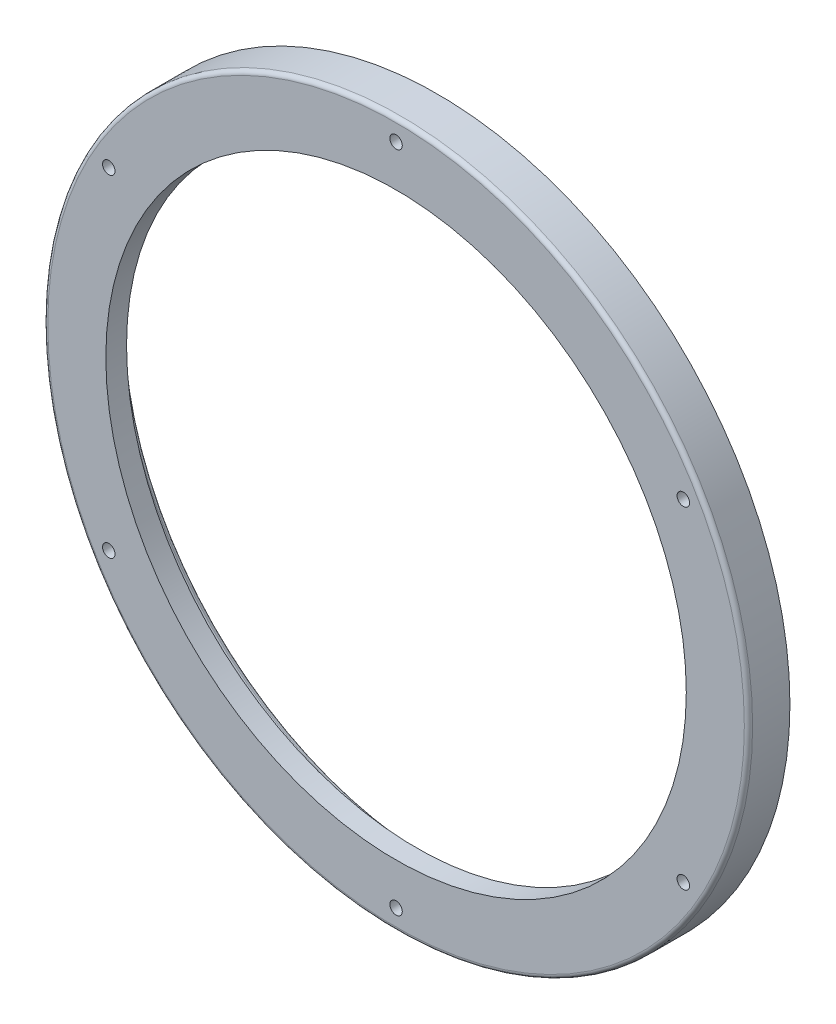
ISO-10303-21;
HEADER;
FILE_DESCRIPTION(('STEP AP214'),'2;1');
FILE_NAME('part.step','',(''),(''),'','','');
FILE_SCHEMA(('AUTOMOTIVE_DESIGN { 1 0 10303 214 1 1 1 1 }'));
ENDSEC;
DATA;
#1=APPLICATION_CONTEXT('core data for automotive mechanical design processes');
#2=APPLICATION_PROTOCOL_DEFINITION('international standard','automotive_design',2000,#1);
#3=PRODUCT_CONTEXT('',#1,'mechanical');
#4=PRODUCT('Part','Part','',(#3));
#5=PRODUCT_RELATED_PRODUCT_CATEGORY('part','',(#4));
#6=PRODUCT_DEFINITION_FORMATION('','',#4);
#7=PRODUCT_DEFINITION_CONTEXT('part definition',#1,'design');
#8=PRODUCT_DEFINITION('design','',#6,#7);
#9=PRODUCT_DEFINITION_SHAPE('','',#8);
#10=(LENGTH_UNIT() NAMED_UNIT(*) SI_UNIT(.MILLI.,.METRE.));
#11=(NAMED_UNIT(*) PLANE_ANGLE_UNIT() SI_UNIT($,.RADIAN.));
#12=(NAMED_UNIT(*) SI_UNIT($,.STERADIAN.) SOLID_ANGLE_UNIT());
#13=UNCERTAINTY_MEASURE_WITH_UNIT(LENGTH_MEASURE(1.E-05),#10,'distance_accuracy_value','');
#14=(GEOMETRIC_REPRESENTATION_CONTEXT(3) GLOBAL_UNCERTAINTY_ASSIGNED_CONTEXT((#13)) GLOBAL_UNIT_ASSIGNED_CONTEXT((#10,
#11,#12)) REPRESENTATION_CONTEXT('',''));
#15=CARTESIAN_POINT('',(0.,0.,0.));
#16=DIRECTION('',(0.,0.,1.));
#17=DIRECTION('',(1.,0.,0.));
#18=AXIS2_PLACEMENT_3D('',#15,#16,#17);
#19=CARTESIAN_POINT('',(0.,0.,10.));
#20=DIRECTION('',(0.,0.,1.));
#21=DIRECTION('',(1.,0.,0.));
#22=AXIS2_PLACEMENT_3D('',#19,#20,#21);
#23=PLANE('',#22);
#24=CARTESIAN_POINT('',(0.,0.,10.));
#25=DIRECTION('',(0.,0.,1.));
#26=DIRECTION('',(1.,0.,0.));
#27=AXIS2_PLACEMENT_3D('',#24,#25,#26);
#28=CIRCLE('',#27,84.);
#29=CARTESIAN_POINT('',(84.,0.,10.));
#30=VERTEX_POINT('',#29);
#31=EDGE_CURVE('E45',#30,#30,#28,.T.);
#32=ORIENTED_EDGE('',*,*,#31,.T.);
#33=EDGE_LOOP('',(#32));
#34=FACE_BOUND('',#33,.T.);
#35=CARTESIAN_POINT('',(69.2820323027546,40.0000000000008,10.));
#36=DIRECTION('',(0.,0.,1.));
#37=DIRECTION('',(1.,0.,0.));
#38=AXIS2_PLACEMENT_3D('',#35,#36,#37);
#39=CIRCLE('',#38,1.5);
#40=CARTESIAN_POINT('',(70.7820323027546,40.0000000000008,10.));
#41=VERTEX_POINT('',#40);
#42=EDGE_CURVE('E75',#41,#41,#39,.F.);
#43=ORIENTED_EDGE('',*,*,#42,.T.);
#44=EDGE_LOOP('',(#43));
#45=FACE_BOUND('',#44,.T.);
#46=CARTESIAN_POINT('',(69.2820323027555,-39.9999999999994,10.));
#47=DIRECTION('',(0.,0.,1.));
#48=DIRECTION('',(1.,0.,0.));
#49=AXIS2_PLACEMENT_3D('',#46,#47,#48);
#50=CIRCLE('',#49,1.5);
#51=CARTESIAN_POINT('',(70.7820323027555,-39.9999999999994,10.));
#52=VERTEX_POINT('',#51);
#53=EDGE_CURVE('E82',#52,#52,#50,.F.);
#54=ORIENTED_EDGE('',*,*,#53,.T.);
#55=EDGE_LOOP('',(#54));
#56=FACE_BOUND('',#55,.T.);
#57=CARTESIAN_POINT('',(0.,-80.,10.));
#58=DIRECTION('',(0.,0.,1.));
#59=DIRECTION('',(1.,0.,0.));
#60=AXIS2_PLACEMENT_3D('',#57,#58,#59);
#61=CIRCLE('',#60,1.5);
#62=CARTESIAN_POINT('',(1.5,-80.,10.));
#63=VERTEX_POINT('',#62);
#64=EDGE_CURVE('E88',#63,#63,#61,.F.);
#65=ORIENTED_EDGE('',*,*,#64,.T.);
#66=EDGE_LOOP('',(#65));
#67=FACE_BOUND('',#66,.T.);
#68=CARTESIAN_POINT('',(-69.2820323027549,-40.0000000000003,10.));
#69=DIRECTION('',(0.,0.,1.));
#70=DIRECTION('',(1.,0.,0.));
#71=AXIS2_PLACEMENT_3D('',#68,#69,#70);
#72=CIRCLE('',#71,1.5);
#73=CARTESIAN_POINT('',(-67.7820323027549,-40.0000000000003,10.));
#74=VERTEX_POINT('',#73);
#75=EDGE_CURVE('E74',#74,#74,#72,.F.);
#76=ORIENTED_EDGE('',*,*,#75,.T.);
#77=EDGE_LOOP('',(#76));
#78=FACE_BOUND('',#77,.T.);
#79=CARTESIAN_POINT('',(-69.2820323027552,39.9999999999999,10.));
#80=DIRECTION('',(0.,0.,1.));
#81=DIRECTION('',(1.,0.,0.));
#82=AXIS2_PLACEMENT_3D('',#79,#80,#81);
#83=CIRCLE('',#82,1.5);
#84=CARTESIAN_POINT('',(-67.7820323027552,39.9999999999999,10.));
#85=VERTEX_POINT('',#84);
#86=EDGE_CURVE('E68',#85,#85,#83,.F.);
#87=ORIENTED_EDGE('',*,*,#86,.T.);
#88=EDGE_LOOP('',(#87));
#89=FACE_BOUND('',#88,.T.);
#90=CARTESIAN_POINT('',(0.,80.,10.));
#91=DIRECTION('',(0.,0.,1.));
#92=DIRECTION('',(1.,0.,0.));
#93=AXIS2_PLACEMENT_3D('',#90,#91,#92);
#94=CIRCLE('',#93,1.5);
#95=CARTESIAN_POINT('',(1.5,80.,10.));
#96=VERTEX_POINT('',#95);
#97=EDGE_CURVE('E62',#96,#96,#94,.F.);
#98=ORIENTED_EDGE('',*,*,#97,.T.);
#99=EDGE_LOOP('',(#98));
#100=FACE_BOUND('',#99,.T.);
#101=CARTESIAN_POINT('',(0.,0.,10.));
#102=DIRECTION('',(0.,0.,1.));
#103=DIRECTION('',(1.,0.,0.));
#104=AXIS2_PLACEMENT_3D('',#101,#102,#103);
#105=CIRCLE('',#104,70.);
#106=CARTESIAN_POINT('',(70.,0.,10.));
#107=VERTEX_POINT('',#106);
#108=EDGE_CURVE('E54',#107,#107,#105,.T.);
#109=ORIENTED_EDGE('',*,*,#108,.F.);
#110=EDGE_LOOP('',(#109));
#111=FACE_BOUND('',#110,.T.);
#112=ADVANCED_FACE('F30',(#34,#45,#56,#67,#78,#89,#100,#111),#23,.T.);
#113=CARTESIAN_POINT('',(0.,0.,0.));
#114=DIRECTION('',(0.,0.,1.));
#115=DIRECTION('',(1.,0.,0.));
#116=AXIS2_PLACEMENT_3D('',#113,#114,#115);
#117=PLANE('',#116);
#118=CARTESIAN_POINT('',(0.,0.,0.));
#119=DIRECTION('',(0.,0.,1.));
#120=DIRECTION('',(1.,0.,0.));
#121=AXIS2_PLACEMENT_3D('',#118,#119,#120);
#122=CIRCLE('',#121,76.);
#123=CARTESIAN_POINT('',(76.,0.,0.));
#124=VERTEX_POINT('',#123);
#125=EDGE_CURVE('E37',#124,#124,#122,.T.);
#126=ORIENTED_EDGE('',*,*,#125,.T.);
#127=EDGE_LOOP('',(#126));
#128=FACE_BOUND('',#127,.T.);
#129=CARTESIAN_POINT('',(69.2820323027546,40.0000000000008,0.));
#130=DIRECTION('',(0.,0.,-1.));
#131=DIRECTION('',(-0.50000000000001,0.866025403784433,0.));
#132=AXIS2_PLACEMENT_3D('',#129,#130,#131);
#133=CIRCLE('',#132,1.5);
#134=CARTESIAN_POINT('',(68.5320323027546,41.2990381056775,0.));
#135=VERTEX_POINT('',#134);
#136=EDGE_CURVE('E79',#135,#135,#133,.T.);
#137=ORIENTED_EDGE('',*,*,#136,.F.);
#138=EDGE_LOOP('',(#137));
#139=FACE_BOUND('',#138,.T.);
#140=CARTESIAN_POINT('',(69.2820323027555,-39.9999999999994,0.));
#141=DIRECTION('',(0.,0.,-1.));
#142=DIRECTION('',(0.499999999999992,0.866025403784443,0.));
#143=AXIS2_PLACEMENT_3D('',#140,#141,#142);
#144=CIRCLE('',#143,1.5);
#145=CARTESIAN_POINT('',(70.0320323027555,-38.7009618943227,0.));
#146=VERTEX_POINT('',#145);
#147=EDGE_CURVE('E78',#146,#146,#144,.T.);
#148=ORIENTED_EDGE('',*,*,#147,.F.);
#149=EDGE_LOOP('',(#148));
#150=FACE_BOUND('',#149,.T.);
#151=CARTESIAN_POINT('',(0.,-80.,0.));
#152=DIRECTION('',(0.,0.,-1.));
#153=DIRECTION('',(1.,0.,0.));
#154=AXIS2_PLACEMENT_3D('',#151,#152,#153);
#155=CIRCLE('',#154,1.5);
#156=CARTESIAN_POINT('',(1.5,-80.,0.));
#157=VERTEX_POINT('',#156);
#158=EDGE_CURVE('E85',#157,#157,#155,.T.);
#159=ORIENTED_EDGE('',*,*,#158,.F.);
#160=EDGE_LOOP('',(#159));
#161=FACE_BOUND('',#160,.T.);
#162=CARTESIAN_POINT('',(-69.2820323027549,-40.0000000000003,0.));
#163=DIRECTION('',(0.,0.,-1.));
#164=DIRECTION('',(0.500000000000004,-0.866025403784436,0.));
#165=AXIS2_PLACEMENT_3D('',#162,#163,#164);
#166=CIRCLE('',#165,1.5);
#167=CARTESIAN_POINT('',(-68.5320323027549,-41.299038105677,0.));
#168=VERTEX_POINT('',#167);
#169=EDGE_CURVE('E91',#168,#168,#166,.T.);
#170=ORIENTED_EDGE('',*,*,#169,.F.);
#171=EDGE_LOOP('',(#170));
#172=FACE_BOUND('',#171,.T.);
#173=CARTESIAN_POINT('',(-69.2820323027552,39.9999999999999,0.));
#174=DIRECTION('',(0.,0.,-1.));
#175=DIRECTION('',(-0.499999999999998,-0.86602540378444,0.));
#176=AXIS2_PLACEMENT_3D('',#173,#174,#175);
#177=CIRCLE('',#176,1.5);
#178=CARTESIAN_POINT('',(-70.0320323027552,38.7009618943232,0.));
#179=VERTEX_POINT('',#178);
#180=EDGE_CURVE('E71',#179,#179,#177,.T.);
#181=ORIENTED_EDGE('',*,*,#180,.F.);
#182=EDGE_LOOP('',(#181));
#183=FACE_BOUND('',#182,.T.);
#184=CARTESIAN_POINT('',(0.,80.,0.));
#185=DIRECTION('',(0.,0.,-1.));
#186=DIRECTION('',(-1.,0.,0.));
#187=AXIS2_PLACEMENT_3D('',#184,#185,#186);
#188=CIRCLE('',#187,1.5);
#189=CARTESIAN_POINT('',(-1.5,80.,0.));
#190=VERTEX_POINT('',#189);
#191=EDGE_CURVE('E65',#190,#190,#188,.T.);
#192=ORIENTED_EDGE('',*,*,#191,.F.);
#193=EDGE_LOOP('',(#192));
#194=FACE_BOUND('',#193,.T.);
#195=CARTESIAN_POINT('',(0.,0.,0.));
#196=DIRECTION('',(0.,0.,1.));
#197=DIRECTION('',(1.,0.,0.));
#198=AXIS2_PLACEMENT_3D('',#195,#196,#197);
#199=CIRCLE('',#198,85.);
#200=CARTESIAN_POINT('',(85.,0.,0.));
#201=VERTEX_POINT('',#200);
#202=EDGE_CURVE('E50',#201,#201,#199,.T.);
#203=ORIENTED_EDGE('',*,*,#202,.F.);
#204=EDGE_LOOP('',(#203));
#205=FACE_BOUND('',#204,.T.);
#206=ADVANCED_FACE('F102',(#128,#139,#150,#161,#172,#183,#194,#205),#117,.F.);
#207=CARTESIAN_POINT('',(0.,0.,10.));
#208=DIRECTION('',(0.,0.,-1.));
#209=DIRECTION('',(-1.,0.,0.));
#210=AXIS2_PLACEMENT_3D('',#207,#208,#209);
#211=CYLINDRICAL_SURFACE('',#210,85.);
#212=CARTESIAN_POINT('',(0.,0.,9.));
#213=DIRECTION('',(0.,0.,1.));
#214=DIRECTION('',(1.,0.,0.));
#215=AXIS2_PLACEMENT_3D('',#212,#213,#214);
#216=CIRCLE('',#215,85.);
#217=CARTESIAN_POINT('',(85.,0.,9.));
#218=VERTEX_POINT('',#217);
#219=EDGE_CURVE('E41',#218,#218,#216,.F.);
#220=ORIENTED_EDGE('',*,*,#219,.T.);
#221=EDGE_LOOP('',(#220));
#222=FACE_BOUND('',#221,.T.);
#223=ORIENTED_EDGE('',*,*,#202,.T.);
#224=EDGE_LOOP('',(#223));
#225=FACE_BOUND('',#224,.T.);
#226=ADVANCED_FACE('F105',(#222,#225),#211,.T.);
#227=CARTESIAN_POINT('',(0.,0.,10.));
#228=DIRECTION('',(0.,0.,-1.));
#229=DIRECTION('',(-1.,0.,0.));
#230=AXIS2_PLACEMENT_3D('',#227,#228,#229);
#231=CYLINDRICAL_SURFACE('',#230,70.);
#232=CARTESIAN_POINT('',(0.,0.,5.));
#233=DIRECTION('',(0.,0.,1.));
#234=DIRECTION('',(1.,0.,0.));
#235=AXIS2_PLACEMENT_3D('',#232,#233,#234);
#236=CIRCLE('',#235,70.);
#237=CARTESIAN_POINT('',(70.,0.,5.));
#238=VERTEX_POINT('',#237);
#239=EDGE_CURVE('E51',#238,#238,#236,.T.);
#240=ORIENTED_EDGE('',*,*,#239,.F.);
#241=EDGE_LOOP('',(#240));
#242=FACE_BOUND('',#241,.T.);
#243=ORIENTED_EDGE('',*,*,#108,.T.);
#244=EDGE_LOOP('',(#243));
#245=FACE_BOUND('',#244,.T.);
#246=ADVANCED_FACE('F114',(#242,#245),#231,.F.);
#247=CARTESIAN_POINT('',(0.,0.,5.));
#248=DIRECTION('',(0.,0.,-1.));
#249=DIRECTION('',(-1.,0.,0.));
#250=AXIS2_PLACEMENT_3D('',#247,#248,#249);
#251=CYLINDRICAL_SURFACE('',#250,75.);
#252=CARTESIAN_POINT('',(0.,0.,1.));
#253=DIRECTION('',(0.,0.,1.));
#254=DIRECTION('',(1.,0.,0.));
#255=AXIS2_PLACEMENT_3D('',#252,#253,#254);
#256=CIRCLE('',#255,75.);
#257=CARTESIAN_POINT('',(75.,0.,1.));
#258=VERTEX_POINT('',#257);
#259=EDGE_CURVE('E10',#258,#258,#256,.F.);
#260=ORIENTED_EDGE('',*,*,#259,.T.);
#261=EDGE_LOOP('',(#260));
#262=FACE_BOUND('',#261,.T.);
#263=CARTESIAN_POINT('',(0.,0.,5.));
#264=DIRECTION('',(0.,0.,1.));
#265=DIRECTION('',(1.,0.,0.));
#266=AXIS2_PLACEMENT_3D('',#263,#264,#265);
#267=CIRCLE('',#266,75.);
#268=CARTESIAN_POINT('',(75.,0.,5.));
#269=VERTEX_POINT('',#268);
#270=EDGE_CURVE('E55',#269,#269,#267,.T.);
#271=ORIENTED_EDGE('',*,*,#270,.T.);
#272=EDGE_LOOP('',(#271));
#273=FACE_BOUND('',#272,.T.);
#274=ADVANCED_FACE('F120',(#262,#273),#251,.F.);
#275=CARTESIAN_POINT('',(0.,0.,5.));
#276=DIRECTION('',(0.,0.,1.));
#277=DIRECTION('',(1.,0.,0.));
#278=AXIS2_PLACEMENT_3D('',#275,#276,#277);
#279=PLANE('',#278);
#280=ORIENTED_EDGE('',*,*,#239,.T.);
#281=EDGE_LOOP('',(#280));
#282=FACE_BOUND('',#281,.T.);
#283=ORIENTED_EDGE('',*,*,#270,.F.);
#284=EDGE_LOOP('',(#283));
#285=FACE_BOUND('',#284,.T.);
#286=ADVANCED_FACE('F132',(#282,#285),#279,.F.);
#287=CARTESIAN_POINT('',(0.,80.,14.2426406871193));
#288=DIRECTION('',(0.,0.,-1.));
#289=DIRECTION('',(-1.,0.,0.));
#290=AXIS2_PLACEMENT_3D('',#287,#288,#289);
#291=CYLINDRICAL_SURFACE('',#290,1.5);
#292=ORIENTED_EDGE('',*,*,#191,.T.);
#293=EDGE_LOOP('',(#292));
#294=FACE_BOUND('',#293,.T.);
#295=ORIENTED_EDGE('',*,*,#97,.F.);
#296=EDGE_LOOP('',(#295));
#297=FACE_BOUND('',#296,.T.);
#298=ADVANCED_FACE('F135',(#294,#297),#291,.F.);
#299=CARTESIAN_POINT('',(-69.2820323027552,39.9999999999999,14.2426406871193));
#300=DIRECTION('',(0.,0.,-1.));
#301=DIRECTION('',(-1.,0.,0.));
#302=AXIS2_PLACEMENT_3D('',#299,#300,#301);
#303=CYLINDRICAL_SURFACE('',#302,1.5);
#304=ORIENTED_EDGE('',*,*,#180,.T.);
#305=EDGE_LOOP('',(#304));
#306=FACE_BOUND('',#305,.T.);
#307=ORIENTED_EDGE('',*,*,#86,.F.);
#308=EDGE_LOOP('',(#307));
#309=FACE_BOUND('',#308,.T.);
#310=ADVANCED_FACE('F139',(#306,#309),#303,.F.);
#311=CARTESIAN_POINT('',(-69.2820323027549,-40.0000000000003,14.2426406871193));
#312=DIRECTION('',(0.,0.,-1.));
#313=DIRECTION('',(-1.,0.,0.));
#314=AXIS2_PLACEMENT_3D('',#311,#312,#313);
#315=CYLINDRICAL_SURFACE('',#314,1.5);
#316=ORIENTED_EDGE('',*,*,#169,.T.);
#317=EDGE_LOOP('',(#316));
#318=FACE_BOUND('',#317,.T.);
#319=ORIENTED_EDGE('',*,*,#75,.F.);
#320=EDGE_LOOP('',(#319));
#321=FACE_BOUND('',#320,.T.);
#322=ADVANCED_FACE('F99',(#318,#321),#315,.F.);
#323=CARTESIAN_POINT('',(0.,-80.,14.2426406871193));
#324=DIRECTION('',(0.,0.,-1.));
#325=DIRECTION('',(-1.,0.,0.));
#326=AXIS2_PLACEMENT_3D('',#323,#324,#325);
#327=CYLINDRICAL_SURFACE('',#326,1.5);
#328=ORIENTED_EDGE('',*,*,#158,.T.);
#329=EDGE_LOOP('',(#328));
#330=FACE_BOUND('',#329,.T.);
#331=ORIENTED_EDGE('',*,*,#64,.F.);
#332=EDGE_LOOP('',(#331));
#333=FACE_BOUND('',#332,.T.);
#334=ADVANCED_FACE('F152',(#330,#333),#327,.F.);
#335=CARTESIAN_POINT('',(69.2820323027555,-39.9999999999994,14.2426406871193));
#336=DIRECTION('',(0.,0.,-1.));
#337=DIRECTION('',(-1.,0.,0.));
#338=AXIS2_PLACEMENT_3D('',#335,#336,#337);
#339=CYLINDRICAL_SURFACE('',#338,1.5);
#340=ORIENTED_EDGE('',*,*,#147,.T.);
#341=EDGE_LOOP('',(#340));
#342=FACE_BOUND('',#341,.T.);
#343=ORIENTED_EDGE('',*,*,#53,.F.);
#344=EDGE_LOOP('',(#343));
#345=FACE_BOUND('',#344,.T.);
#346=ADVANCED_FACE('F148',(#342,#345),#339,.F.);
#347=CARTESIAN_POINT('',(69.2820323027546,40.0000000000008,14.2426406871193));
#348=DIRECTION('',(0.,0.,-1.));
#349=DIRECTION('',(-1.,0.,0.));
#350=AXIS2_PLACEMENT_3D('',#347,#348,#349);
#351=CYLINDRICAL_SURFACE('',#350,1.5);
#352=ORIENTED_EDGE('',*,*,#136,.T.);
#353=EDGE_LOOP('',(#352));
#354=FACE_BOUND('',#353,.T.);
#355=ORIENTED_EDGE('',*,*,#42,.F.);
#356=EDGE_LOOP('',(#355));
#357=FACE_BOUND('',#356,.T.);
#358=ADVANCED_FACE('F144',(#354,#357),#351,.F.);
#359=CARTESIAN_POINT('',(0.,0.,9.));
#360=DIRECTION('',(0.,0.,1.));
#361=DIRECTION('',(1.,0.,0.));
#362=AXIS2_PLACEMENT_3D('',#359,#360,#361);
#363=TOROIDAL_SURFACE('',#362,84.,1.);
#364=ORIENTED_EDGE('',*,*,#219,.F.);
#365=EDGE_LOOP('',(#364));
#366=FACE_BOUND('',#365,.T.);
#367=ORIENTED_EDGE('',*,*,#31,.F.);
#368=EDGE_LOOP('',(#367));
#369=FACE_BOUND('',#368,.T.);
#370=ADVANCED_FACE('F147',(#366,#369),#363,.T.);
#371=CARTESIAN_POINT('',(0.,0.,1.));
#372=DIRECTION('',(0.,0.,1.));
#373=DIRECTION('',(1.,0.,0.));
#374=AXIS2_PLACEMENT_3D('',#371,#372,#373);
#375=TOROIDAL_SURFACE('',#374,76.,1.);
#376=ORIENTED_EDGE('',*,*,#259,.F.);
#377=EDGE_LOOP('',(#376));
#378=FACE_BOUND('',#377,.T.);
#379=ORIENTED_EDGE('',*,*,#125,.F.);
#380=EDGE_LOOP('',(#379));
#381=FACE_BOUND('',#380,.T.);
#382=ADVANCED_FACE('F32',(#378,#381),#375,.T.);
#383=CLOSED_SHELL('',(#112,#206,#226,#246,#274,#286,#298,#310,#322,#334,#346,#358,#370,#382));
#384=MANIFOLD_SOLID_BREP('B2',#383);
#385=ADVANCED_BREP_SHAPE_REPRESENTATION('',(#18,#384),#14);
#386=SHAPE_DEFINITION_REPRESENTATION(#9,#385);
ENDSEC;
END-ISO-10303-21;
